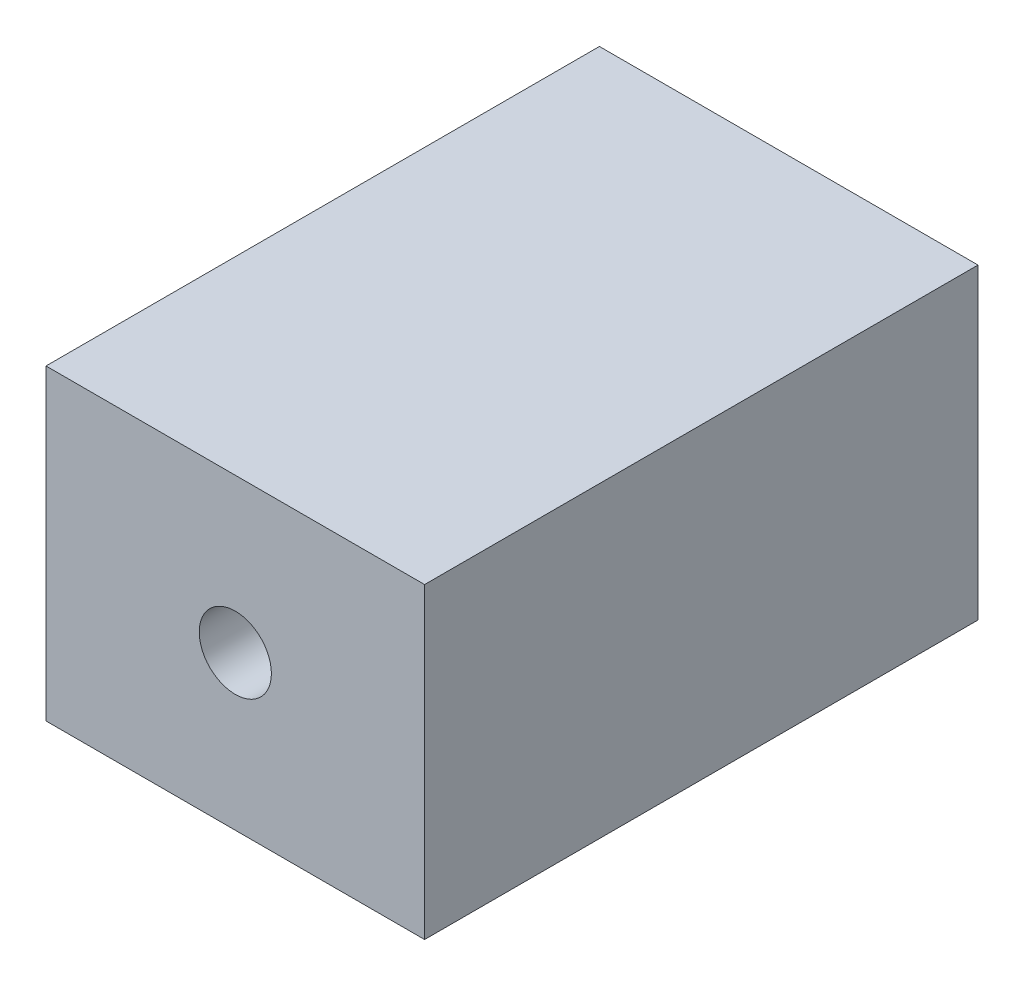
ISO-10303-21;
HEADER;
FILE_DESCRIPTION(('STEP AP214'),'2;1');
FILE_NAME('part.step','',(''),(''),'','','');
FILE_SCHEMA(('AUTOMOTIVE_DESIGN { 1 0 10303 214 1 1 1 1 }'));
ENDSEC;
DATA;
#1=APPLICATION_CONTEXT('core data for automotive mechanical design processes');
#2=APPLICATION_PROTOCOL_DEFINITION('international standard','automotive_design',2000,#1);
#3=PRODUCT_CONTEXT('',#1,'mechanical');
#4=PRODUCT('Part','Part','',(#3));
#5=PRODUCT_RELATED_PRODUCT_CATEGORY('part','',(#4));
#6=PRODUCT_DEFINITION_FORMATION('','',#4);
#7=PRODUCT_DEFINITION_CONTEXT('part definition',#1,'design');
#8=PRODUCT_DEFINITION('design','',#6,#7);
#9=PRODUCT_DEFINITION_SHAPE('','',#8);
#10=(LENGTH_UNIT() NAMED_UNIT(*) SI_UNIT(.MILLI.,.METRE.));
#11=(NAMED_UNIT(*) PLANE_ANGLE_UNIT() SI_UNIT($,.RADIAN.));
#12=(NAMED_UNIT(*) SI_UNIT($,.STERADIAN.) SOLID_ANGLE_UNIT());
#13=UNCERTAINTY_MEASURE_WITH_UNIT(LENGTH_MEASURE(1.E-05),#10,'distance_accuracy_value','');
#14=(GEOMETRIC_REPRESENTATION_CONTEXT(3) GLOBAL_UNCERTAINTY_ASSIGNED_CONTEXT((#13)) GLOBAL_UNIT_ASSIGNED_CONTEXT((#10,
#11,#12)) REPRESENTATION_CONTEXT('',''));
#15=CARTESIAN_POINT('',(0.,0.,0.));
#16=DIRECTION('',(0.,0.,1.));
#17=DIRECTION('',(1.,0.,0.));
#18=AXIS2_PLACEMENT_3D('',#15,#16,#17);
#19=CARTESIAN_POINT('',(0.,0.,108.9));
#20=DIRECTION('',(0.,0.,-1.));
#21=DIRECTION('',(-1.,0.,0.));
#22=AXIS2_PLACEMENT_3D('',#19,#20,#21);
#23=PLANE('',#22);
#24=DIRECTION('',(0.,-1.,0.));
#25=VECTOR('',#24,1.);
#26=CARTESIAN_POINT('',(-37.25,-30.25,108.9));
#27=LINE('',#26,#25);
#28=CARTESIAN_POINT('',(-37.25,30.25,108.9));
#29=VERTEX_POINT('',#28);
#30=CARTESIAN_POINT('',(-37.25,-30.25,108.9));
#31=VERTEX_POINT('',#30);
#32=EDGE_CURVE('E93',#29,#31,#27,.T.);
#33=ORIENTED_EDGE('',*,*,#32,.T.);
#34=DIRECTION('',(1.,0.,0.));
#35=VECTOR('',#34,1.);
#36=CARTESIAN_POINT('',(-37.25,-30.25,108.9));
#37=LINE('',#36,#35);
#38=CARTESIAN_POINT('',(37.25,-30.25,108.9));
#39=VERTEX_POINT('',#38);
#40=EDGE_CURVE('E88',#31,#39,#37,.T.);
#41=ORIENTED_EDGE('',*,*,#40,.T.);
#42=DIRECTION('',(0.,1.,0.));
#43=VECTOR('',#42,1.);
#44=CARTESIAN_POINT('',(37.25,-30.25,108.9));
#45=LINE('',#44,#43);
#46=CARTESIAN_POINT('',(37.25,30.25,108.9));
#47=VERTEX_POINT('',#46);
#48=EDGE_CURVE('E90',#39,#47,#45,.T.);
#49=ORIENTED_EDGE('',*,*,#48,.T.);
#50=DIRECTION('',(-1.,0.,0.));
#51=VECTOR('',#50,1.);
#52=CARTESIAN_POINT('',(-37.25,30.25,108.9));
#53=LINE('',#52,#51);
#54=EDGE_CURVE('E57',#47,#29,#53,.T.);
#55=ORIENTED_EDGE('',*,*,#54,.T.);
#56=EDGE_LOOP('',(#33,#41,#49,#55));
#57=FACE_BOUND('',#56,.T.);
#58=CARTESIAN_POINT('',(0.,0.,108.9));
#59=DIRECTION('',(0.,0.,1.));
#60=DIRECTION('',(1.,0.,0.));
#61=AXIS2_PLACEMENT_3D('',#58,#59,#60);
#62=CIRCLE('',#61,7.1);
#63=CARTESIAN_POINT('',(7.1,0.,108.9));
#64=VERTEX_POINT('',#63);
#65=EDGE_CURVE('E106',#64,#64,#62,.T.);
#66=ORIENTED_EDGE('',*,*,#65,.F.);
#67=EDGE_LOOP('',(#66));
#68=FACE_BOUND('',#67,.T.);
#69=ADVANCED_FACE('F39',(#57,#68),#23,.F.);
#70=CARTESIAN_POINT('',(0.,0.,0.));
#71=DIRECTION('',(0.,0.,-1.));
#72=DIRECTION('',(-1.,0.,0.));
#73=AXIS2_PLACEMENT_3D('',#70,#71,#72);
#74=PLANE('',#73);
#75=CARTESIAN_POINT('',(0.,0.,0.));
#76=DIRECTION('',(0.,0.,1.));
#77=DIRECTION('',(1.,0.,0.));
#78=AXIS2_PLACEMENT_3D('',#75,#76,#77);
#79=CIRCLE('',#78,25.);
#80=CARTESIAN_POINT('',(25.,0.,0.));
#81=VERTEX_POINT('',#80);
#82=EDGE_CURVE('E116',#81,#81,#79,.T.);
#83=ORIENTED_EDGE('',*,*,#82,.T.);
#84=EDGE_LOOP('',(#83));
#85=FACE_BOUND('',#84,.T.);
#86=DIRECTION('',(0.,-1.,0.));
#87=VECTOR('',#86,1.);
#88=CARTESIAN_POINT('',(-37.25,-30.25,0.));
#89=LINE('',#88,#87);
#90=CARTESIAN_POINT('',(-37.25,30.25,0.));
#91=VERTEX_POINT('',#90);
#92=CARTESIAN_POINT('',(-37.25,-30.25,0.));
#93=VERTEX_POINT('',#92);
#94=EDGE_CURVE('E103',#91,#93,#89,.T.);
#95=ORIENTED_EDGE('',*,*,#94,.F.);
#96=DIRECTION('',(-1.,0.,0.));
#97=VECTOR('',#96,1.);
#98=CARTESIAN_POINT('',(-37.25,30.25,0.));
#99=LINE('',#98,#97);
#100=CARTESIAN_POINT('',(37.25,30.25,0.));
#101=VERTEX_POINT('',#100);
#102=EDGE_CURVE('E76',#101,#91,#99,.T.);
#103=ORIENTED_EDGE('',*,*,#102,.F.);
#104=DIRECTION('',(0.,1.,0.));
#105=VECTOR('',#104,1.);
#106=CARTESIAN_POINT('',(37.25,-30.25,0.));
#107=LINE('',#106,#105);
#108=CARTESIAN_POINT('',(37.25,-30.25,0.));
#109=VERTEX_POINT('',#108);
#110=EDGE_CURVE('E71',#109,#101,#107,.T.);
#111=ORIENTED_EDGE('',*,*,#110,.F.);
#112=DIRECTION('',(1.,0.,0.));
#113=VECTOR('',#112,1.);
#114=CARTESIAN_POINT('',(-37.25,-30.25,0.));
#115=LINE('',#114,#113);
#116=EDGE_CURVE('E92',#93,#109,#115,.T.);
#117=ORIENTED_EDGE('',*,*,#116,.F.);
#118=EDGE_LOOP('',(#95,#103,#111,#117));
#119=FACE_BOUND('',#118,.T.);
#120=ADVANCED_FACE('F111',(#85,#119),#74,.T.);
#121=CARTESIAN_POINT('',(-37.25,-30.25,108.9));
#122=DIRECTION('',(1.,0.,0.));
#123=DIRECTION('',(0.,0.,-1.));
#124=AXIS2_PLACEMENT_3D('',#121,#122,#123);
#125=PLANE('',#124);
#126=ORIENTED_EDGE('',*,*,#94,.T.);
#127=DIRECTION('',(0.,0.,-1.));
#128=VECTOR('',#127,1.);
#129=CARTESIAN_POINT('',(-37.25,-30.25,108.9));
#130=LINE('',#129,#128);
#131=EDGE_CURVE('E11',#31,#93,#130,.T.);
#132=ORIENTED_EDGE('',*,*,#131,.F.);
#133=ORIENTED_EDGE('',*,*,#32,.F.);
#134=DIRECTION('',(0.,0.,-1.));
#135=VECTOR('',#134,1.);
#136=CARTESIAN_POINT('',(-37.25,30.25,108.9));
#137=LINE('',#136,#135);
#138=EDGE_CURVE('E97',#29,#91,#137,.T.);
#139=ORIENTED_EDGE('',*,*,#138,.T.);
#140=EDGE_LOOP('',(#126,#132,#133,#139));
#141=FACE_BOUND('',#140,.T.);
#142=ADVANCED_FACE('F41',(#141),#125,.F.);
#143=CARTESIAN_POINT('',(-37.25,-30.25,108.9));
#144=DIRECTION('',(0.,1.,0.));
#145=DIRECTION('',(0.,0.,1.));
#146=AXIS2_PLACEMENT_3D('',#143,#144,#145);
#147=PLANE('',#146);
#148=ORIENTED_EDGE('',*,*,#116,.T.);
#149=DIRECTION('',(0.,0.,-1.));
#150=VECTOR('',#149,1.);
#151=CARTESIAN_POINT('',(37.25,-30.25,108.9));
#152=LINE('',#151,#150);
#153=EDGE_CURVE('E48',#39,#109,#152,.T.);
#154=ORIENTED_EDGE('',*,*,#153,.F.);
#155=ORIENTED_EDGE('',*,*,#40,.F.);
#156=ORIENTED_EDGE('',*,*,#131,.T.);
#157=EDGE_LOOP('',(#148,#154,#155,#156));
#158=FACE_BOUND('',#157,.T.);
#159=ADVANCED_FACE('F94',(#158),#147,.F.);
#160=CARTESIAN_POINT('',(37.25,-30.25,108.9));
#161=DIRECTION('',(-1.,0.,0.));
#162=DIRECTION('',(0.,0.,1.));
#163=AXIS2_PLACEMENT_3D('',#160,#161,#162);
#164=PLANE('',#163);
#165=ORIENTED_EDGE('',*,*,#110,.T.);
#166=DIRECTION('',(0.,0.,-1.));
#167=VECTOR('',#166,1.);
#168=CARTESIAN_POINT('',(37.25,30.25,108.9));
#169=LINE('',#168,#167);
#170=EDGE_CURVE('E96',#47,#101,#169,.T.);
#171=ORIENTED_EDGE('',*,*,#170,.F.);
#172=ORIENTED_EDGE('',*,*,#48,.F.);
#173=ORIENTED_EDGE('',*,*,#153,.T.);
#174=EDGE_LOOP('',(#165,#171,#172,#173));
#175=FACE_BOUND('',#174,.T.);
#176=ADVANCED_FACE('F100',(#175),#164,.F.);
#177=CARTESIAN_POINT('',(-37.25,30.25,108.9));
#178=DIRECTION('',(0.,-1.,0.));
#179=DIRECTION('',(0.,0.,-1.));
#180=AXIS2_PLACEMENT_3D('',#177,#178,#179);
#181=PLANE('',#180);
#182=ORIENTED_EDGE('',*,*,#102,.T.);
#183=ORIENTED_EDGE('',*,*,#138,.F.);
#184=ORIENTED_EDGE('',*,*,#54,.F.);
#185=ORIENTED_EDGE('',*,*,#170,.T.);
#186=EDGE_LOOP('',(#182,#183,#184,#185));
#187=FACE_BOUND('',#186,.T.);
#188=ADVANCED_FACE('F112',(#187),#181,.F.);
#189=CARTESIAN_POINT('',(0.,0.,108.9));
#190=DIRECTION('',(0.,0.,-1.));
#191=DIRECTION('',(-1.,0.,0.));
#192=AXIS2_PLACEMENT_3D('',#189,#190,#191);
#193=CYLINDRICAL_SURFACE('',#192,7.1);
#194=ORIENTED_EDGE('',*,*,#65,.T.);
#195=EDGE_LOOP('',(#194));
#196=FACE_BOUND('',#195,.T.);
#197=CARTESIAN_POINT('',(0.,0.,-2.));
#198=DIRECTION('',(0.,0.,1.));
#199=DIRECTION('',(1.,0.,0.));
#200=AXIS2_PLACEMENT_3D('',#197,#198,#199);
#201=CIRCLE('',#200,7.1);
#202=CARTESIAN_POINT('',(7.1,0.,-2.));
#203=VERTEX_POINT('',#202);
#204=EDGE_CURVE('E122',#203,#203,#201,.T.);
#205=ORIENTED_EDGE('',*,*,#204,.F.);
#206=EDGE_LOOP('',(#205));
#207=FACE_BOUND('',#206,.T.);
#208=ADVANCED_FACE('F132',(#196,#207),#193,.F.);
#209=CARTESIAN_POINT('',(0.,0.,-2.));
#210=DIRECTION('',(0.,0.,1.));
#211=DIRECTION('',(1.,0.,0.));
#212=AXIS2_PLACEMENT_3D('',#209,#210,#211);
#213=PLANE('',#212);
#214=CARTESIAN_POINT('',(0.,0.,-2.));
#215=DIRECTION('',(0.,0.,1.));
#216=DIRECTION('',(1.,0.,0.));
#217=AXIS2_PLACEMENT_3D('',#214,#215,#216);
#218=CIRCLE('',#217,25.);
#219=CARTESIAN_POINT('',(25.,0.,-2.));
#220=VERTEX_POINT('',#219);
#221=EDGE_CURVE('E118',#220,#220,#218,.T.);
#222=ORIENTED_EDGE('',*,*,#221,.F.);
#223=EDGE_LOOP('',(#222));
#224=FACE_BOUND('',#223,.T.);
#225=ORIENTED_EDGE('',*,*,#204,.T.);
#226=EDGE_LOOP('',(#225));
#227=FACE_BOUND('',#226,.T.);
#228=ADVANCED_FACE('F129',(#224,#227),#213,.F.);
#229=CARTESIAN_POINT('',(0.,0.,0.));
#230=DIRECTION('',(0.,0.,-1.));
#231=DIRECTION('',(-1.,0.,0.));
#232=AXIS2_PLACEMENT_3D('',#229,#230,#231);
#233=CYLINDRICAL_SURFACE('',#232,25.);
#234=ORIENTED_EDGE('',*,*,#82,.F.);
#235=EDGE_LOOP('',(#234));
#236=FACE_BOUND('',#235,.T.);
#237=ORIENTED_EDGE('',*,*,#221,.T.);
#238=EDGE_LOOP('',(#237));
#239=FACE_BOUND('',#238,.T.);
#240=ADVANCED_FACE('F138',(#236,#239),#233,.T.);
#241=CLOSED_SHELL('',(#69,#120,#142,#159,#176,#188,#208,#228,#240));
#242=MANIFOLD_SOLID_BREP('B2',#241);
#243=ADVANCED_BREP_SHAPE_REPRESENTATION('',(#18,#242),#14);
#244=SHAPE_DEFINITION_REPRESENTATION(#9,#243);
ENDSEC;
END-ISO-10303-21;
